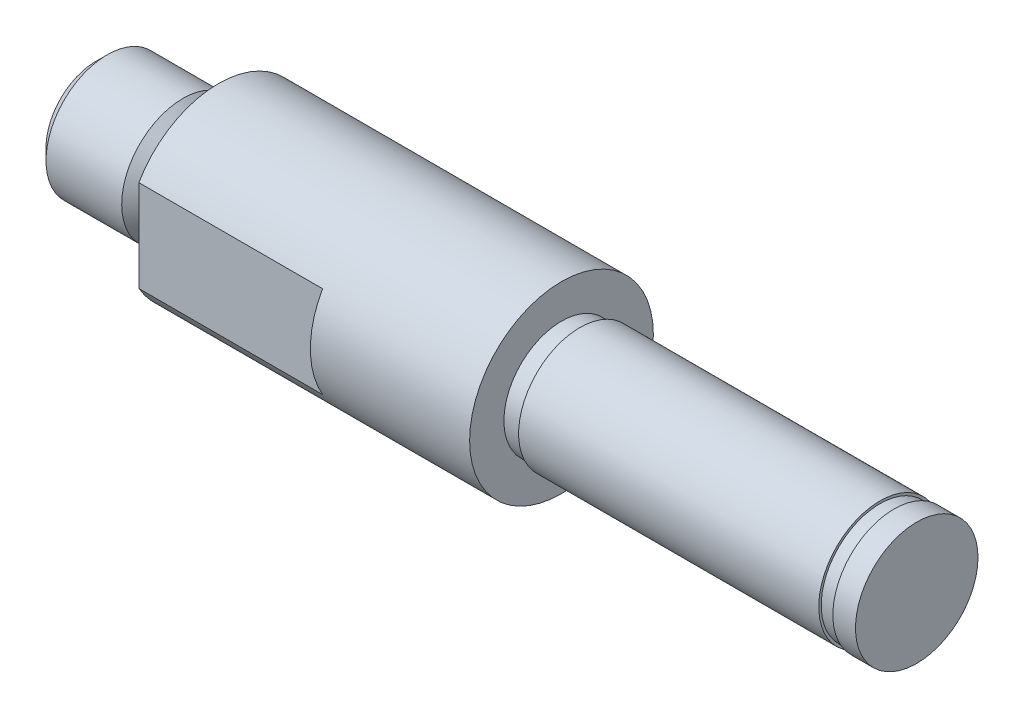
ISO-10303-21;
HEADER;
FILE_DESCRIPTION(('STEP AP214'),'2;1');
FILE_NAME('part.step','',(''),(''),'','','');
FILE_SCHEMA(('AUTOMOTIVE_DESIGN { 1 0 10303 214 1 1 1 1 }'));
ENDSEC;
DATA;
#1=APPLICATION_CONTEXT('core data for automotive mechanical design processes');
#2=APPLICATION_PROTOCOL_DEFINITION('international standard','automotive_design',2000,#1);
#3=PRODUCT_CONTEXT('',#1,'mechanical');
#4=PRODUCT('Part','Part','',(#3));
#5=PRODUCT_RELATED_PRODUCT_CATEGORY('part','',(#4));
#6=PRODUCT_DEFINITION_FORMATION('','',#4);
#7=PRODUCT_DEFINITION_CONTEXT('part definition',#1,'design');
#8=PRODUCT_DEFINITION('design','',#6,#7);
#9=PRODUCT_DEFINITION_SHAPE('','',#8);
#10=(LENGTH_UNIT() NAMED_UNIT(*) SI_UNIT(.MILLI.,.METRE.));
#11=(NAMED_UNIT(*) PLANE_ANGLE_UNIT() SI_UNIT($,.RADIAN.));
#12=(NAMED_UNIT(*) SI_UNIT($,.STERADIAN.) SOLID_ANGLE_UNIT());
#13=UNCERTAINTY_MEASURE_WITH_UNIT(LENGTH_MEASURE(1.E-05),#10,'distance_accuracy_value','');
#14=(GEOMETRIC_REPRESENTATION_CONTEXT(3) GLOBAL_UNCERTAINTY_ASSIGNED_CONTEXT((#13)) GLOBAL_UNIT_ASSIGNED_CONTEXT((#10,
#11,#12)) REPRESENTATION_CONTEXT('',''));
#15=CARTESIAN_POINT('',(0.,0.,0.));
#16=DIRECTION('',(0.,0.,1.));
#17=DIRECTION('',(1.,0.,0.));
#18=AXIS2_PLACEMENT_3D('',#15,#16,#17);
#19=CARTESIAN_POINT('',(67.,2.5,0.));
#20=DIRECTION('',(1.,0.,0.));
#21=DIRECTION('',(0.,0.,-1.));
#22=AXIS2_PLACEMENT_3D('',#19,#20,#21);
#23=PLANE('',#22);
#24=CARTESIAN_POINT('',(67.,0.,0.));
#25=DIRECTION('',(1.,0.,0.));
#26=DIRECTION('',(0.,0.,-1.));
#27=AXIS2_PLACEMENT_3D('',#24,#25,#26);
#28=CIRCLE('',#27,5.);
#29=CARTESIAN_POINT('',(67.,0.,-5.));
#30=VERTEX_POINT('',#29);
#31=EDGE_CURVE('E115',#30,#30,#28,.F.);
#32=ORIENTED_EDGE('',*,*,#31,.F.);
#33=EDGE_LOOP('',(#32));
#34=FACE_BOUND('',#33,.T.);
#35=ADVANCED_FACE('F17',(#34),#23,.T.);
#36=CARTESIAN_POINT('',(0.,2.04,0.));
#37=DIRECTION('',(-1.,0.,0.));
#38=DIRECTION('',(0.,0.,1.));
#39=AXIS2_PLACEMENT_3D('',#36,#37,#38);
#40=PLANE('',#39);
#41=CARTESIAN_POINT('',(0.,0.,0.));
#42=DIRECTION('',(1.,0.,0.));
#43=DIRECTION('',(0.,0.,-1.));
#44=AXIS2_PLACEMENT_3D('',#41,#42,#43);
#45=CIRCLE('',#44,4.08000000010134);
#46=CARTESIAN_POINT('',(0.,0.,-4.08000000010134));
#47=VERTEX_POINT('',#46);
#48=EDGE_CURVE('E112',#47,#47,#45,.T.);
#49=ORIENTED_EDGE('',*,*,#48,.F.);
#50=EDGE_LOOP('',(#49));
#51=FACE_BOUND('',#50,.T.);
#52=ADVANCED_FACE('F197',(#51),#40,.T.);
#53=CARTESIAN_POINT('',(66.075,0.,0.));
#54=DIRECTION('',(1.,0.,0.));
#55=DIRECTION('',(0.,0.,-1.));
#56=AXIS2_PLACEMENT_3D('',#53,#54,#55);
#57=CYLINDRICAL_SURFACE('',#56,5.);
#58=CARTESIAN_POINT('',(65.15,0.,0.));
#59=DIRECTION('',(1.,0.,0.));
#60=DIRECTION('',(0.,0.,-1.));
#61=AXIS2_PLACEMENT_3D('',#58,#59,#60);
#62=CIRCLE('',#61,5.);
#63=CARTESIAN_POINT('',(65.15,0.,-5.));
#64=VERTEX_POINT('',#63);
#65=EDGE_CURVE('E109',#64,#64,#62,.F.);
#66=ORIENTED_EDGE('',*,*,#65,.F.);
#67=EDGE_LOOP('',(#66));
#68=FACE_BOUND('',#67,.T.);
#69=ORIENTED_EDGE('',*,*,#31,.T.);
#70=EDGE_LOOP('',(#69));
#71=FACE_BOUND('',#70,.T.);
#72=ADVANCED_FACE('F194',(#68,#71),#57,.T.);
#73=CARTESIAN_POINT('',(0.91999999995096,0.,0.));
#74=DIRECTION('',(1.,0.,0.));
#75=DIRECTION('',(0.,0.,-1.));
#76=AXIS2_PLACEMENT_3D('',#73,#74,#75);
#77=CONICAL_SURFACE('',#76,5.0000000000523,0.785398163397448);
#78=ORIENTED_EDGE('',*,*,#48,.T.);
#79=EDGE_LOOP('',(#78));
#80=FACE_BOUND('',#79,.T.);
#81=CARTESIAN_POINT('',(0.92,0.,0.));
#82=DIRECTION('',(1.,0.,0.));
#83=DIRECTION('',(0.,0.,-1.));
#84=AXIS2_PLACEMENT_3D('',#81,#82,#83);
#85=CIRCLE('',#84,5.);
#86=CARTESIAN_POINT('',(0.92,0.,-5.));
#87=VERTEX_POINT('',#86);
#88=EDGE_CURVE('E108',#87,#87,#85,.T.);
#89=ORIENTED_EDGE('',*,*,#88,.F.);
#90=EDGE_LOOP('',(#89));
#91=FACE_BOUND('',#90,.T.);
#92=ADVANCED_FACE('F190',(#80,#91),#77,.T.);
#93=CARTESIAN_POINT('',(65.15,4.9,0.));
#94=DIRECTION('',(-1.,0.,0.));
#95=DIRECTION('',(0.,0.,1.));
#96=AXIS2_PLACEMENT_3D('',#93,#94,#95);
#97=PLANE('',#96);
#98=ORIENTED_EDGE('',*,*,#65,.T.);
#99=EDGE_LOOP('',(#98));
#100=FACE_BOUND('',#99,.T.);
#101=CARTESIAN_POINT('',(65.15,0.,0.));
#102=DIRECTION('',(1.,0.,0.));
#103=DIRECTION('',(0.,0.,-1.));
#104=AXIS2_PLACEMENT_3D('',#101,#102,#103);
#105=CIRCLE('',#104,4.8);
#106=CARTESIAN_POINT('',(65.15,0.,-4.8));
#107=VERTEX_POINT('',#106);
#108=EDGE_CURVE('E105',#107,#107,#105,.F.);
#109=ORIENTED_EDGE('',*,*,#108,.F.);
#110=EDGE_LOOP('',(#109));
#111=FACE_BOUND('',#110,.T.);
#112=ADVANCED_FACE('F186',(#100,#111),#97,.T.);
#113=CARTESIAN_POINT('',(4.01,0.,0.));
#114=DIRECTION('',(1.,0.,0.));
#115=DIRECTION('',(0.,0.,-1.));
#116=AXIS2_PLACEMENT_3D('',#113,#114,#115);
#117=CYLINDRICAL_SURFACE('',#116,5.);
#118=ORIENTED_EDGE('',*,*,#88,.T.);
#119=EDGE_LOOP('',(#118));
#120=FACE_BOUND('',#119,.T.);
#121=CARTESIAN_POINT('',(7.10000000003674,0.,0.));
#122=DIRECTION('',(-1.,0.,0.));
#123=DIRECTION('',(0.,1.,0.));
#124=AXIS2_PLACEMENT_3D('',#121,#122,#123);
#125=CIRCLE('',#124,4.99999999999545);
#126=CARTESIAN_POINT('',(7.10000000003674,4.99999999999545,0.));
#127=VERTEX_POINT('',#126);
#128=EDGE_CURVE('E104',#127,#127,#125,.F.);
#129=ORIENTED_EDGE('',*,*,#128,.F.);
#130=EDGE_LOOP('',(#129));
#131=FACE_BOUND('',#130,.T.);
#132=ADVANCED_FACE('F182',(#120,#131),#117,.T.);
#133=CARTESIAN_POINT('',(64.575,0.,0.));
#134=DIRECTION('',(1.,0.,0.));
#135=DIRECTION('',(0.,0.,-1.));
#136=AXIS2_PLACEMENT_3D('',#133,#134,#135);
#137=CYLINDRICAL_SURFACE('',#136,4.8);
#138=CARTESIAN_POINT('',(64.,0.,0.));
#139=DIRECTION('',(1.,0.,0.));
#140=DIRECTION('',(0.,0.,-1.));
#141=AXIS2_PLACEMENT_3D('',#138,#139,#140);
#142=CIRCLE('',#141,4.8);
#143=CARTESIAN_POINT('',(64.,0.,-4.8));
#144=VERTEX_POINT('',#143);
#145=EDGE_CURVE('E101',#144,#144,#142,.F.);
#146=ORIENTED_EDGE('',*,*,#145,.F.);
#147=EDGE_LOOP('',(#146));
#148=FACE_BOUND('',#147,.T.);
#149=ORIENTED_EDGE('',*,*,#108,.T.);
#150=EDGE_LOOP('',(#149));
#151=FACE_BOUND('',#150,.T.);
#152=ADVANCED_FACE('F178',(#148,#151),#137,.T.);
#153=CARTESIAN_POINT('',(7.10000000009359,0.,0.));
#154=DIRECTION('',(-1.,0.,0.));
#155=DIRECTION('',(0.,0.,1.));
#156=AXIS2_PLACEMENT_3D('',#153,#154,#155);
#157=CONICAL_SURFACE('',#156,4.99999999993861,0.785398163397448);
#158=ORIENTED_EDGE('',*,*,#128,.T.);
#159=EDGE_LOOP('',(#158));
#160=FACE_BOUND('',#159,.T.);
#161=CARTESIAN_POINT('',(7.88284271247462,0.,0.));
#162=DIRECTION('',(-1.,0.,0.));
#163=DIRECTION('',(0.,0.,1.));
#164=AXIS2_PLACEMENT_3D('',#161,#162,#163);
#165=CIRCLE('',#164,4.21715728752538);
#166=CARTESIAN_POINT('',(7.88284271247462,0.,4.21715728752538));
#167=VERTEX_POINT('',#166);
#168=EDGE_CURVE('E100',#167,#167,#165,.T.);
#169=ORIENTED_EDGE('',*,*,#168,.T.);
#170=EDGE_LOOP('',(#169));
#171=FACE_BOUND('',#170,.T.);
#172=ADVANCED_FACE('F174',(#160,#171),#157,.T.);
#173=CARTESIAN_POINT('',(64.,4.9,0.));
#174=DIRECTION('',(1.,0.,0.));
#175=DIRECTION('',(0.,0.,-1.));
#176=AXIS2_PLACEMENT_3D('',#173,#174,#175);
#177=PLANE('',#176);
#178=ORIENTED_EDGE('',*,*,#145,.T.);
#179=EDGE_LOOP('',(#178));
#180=FACE_BOUND('',#179,.T.);
#181=CARTESIAN_POINT('',(64.,0.,0.));
#182=DIRECTION('',(1.,0.,0.));
#183=DIRECTION('',(0.,0.,-1.));
#184=AXIS2_PLACEMENT_3D('',#181,#182,#183);
#185=CIRCLE('',#184,5.);
#186=CARTESIAN_POINT('',(64.,0.,-5.));
#187=VERTEX_POINT('',#186);
#188=EDGE_CURVE('E97',#187,#187,#185,.F.);
#189=ORIENTED_EDGE('',*,*,#188,.F.);
#190=EDGE_LOOP('',(#189));
#191=FACE_BOUND('',#190,.T.);
#192=ADVANCED_FACE('F170',(#180,#191),#177,.T.);
#193=CARTESIAN_POINT('',(8.16568542494924,0.,0.));
#194=DIRECTION('',(-1.,0.,0.));
#195=DIRECTION('',(0.,0.,1.));
#196=AXIS2_PLACEMENT_3D('',#193,#194,#195);
#197=TOROIDAL_SURFACE('',#196,4.5,0.400000000000005);
#198=CARTESIAN_POINT('',(8.16568542494924,0.,0.));
#199=DIRECTION('',(1.,0.,0.));
#200=DIRECTION('',(0.,0.,-1.));
#201=AXIS2_PLACEMENT_3D('',#198,#199,#200);
#202=CIRCLE('',#201,4.1);
#203=CARTESIAN_POINT('',(8.16568542494924,0.,-4.1));
#204=VERTEX_POINT('',#203);
#205=EDGE_CURVE('E96',#204,#204,#202,.T.);
#206=ORIENTED_EDGE('',*,*,#205,.F.);
#207=EDGE_LOOP('',(#206));
#208=FACE_BOUND('',#207,.T.);
#209=ORIENTED_EDGE('',*,*,#168,.F.);
#210=EDGE_LOOP('',(#209));
#211=FACE_BOUND('',#210,.T.);
#212=ADVANCED_FACE('F165',(#208,#211),#197,.F.);
#213=CARTESIAN_POINT('',(51.1,0.,0.));
#214=DIRECTION('',(1.,0.,0.));
#215=DIRECTION('',(0.,0.,-1.));
#216=AXIS2_PLACEMENT_3D('',#213,#214,#215);
#217=CYLINDRICAL_SURFACE('',#216,5.);
#218=ORIENTED_EDGE('',*,*,#188,.T.);
#219=EDGE_LOOP('',(#218));
#220=FACE_BOUND('',#219,.T.);
#221=CARTESIAN_POINT('',(39.5,0.,0.));
#222=DIRECTION('',(1.,0.,0.));
#223=DIRECTION('',(0.,0.,-1.));
#224=AXIS2_PLACEMENT_3D('',#221,#222,#223);
#225=CIRCLE('',#224,5.);
#226=CARTESIAN_POINT('',(39.5,0.,-5.));
#227=VERTEX_POINT('',#226);
#228=EDGE_CURVE('E93',#227,#227,#225,.T.);
#229=ORIENTED_EDGE('',*,*,#228,.T.);
#230=EDGE_LOOP('',(#229));
#231=FACE_BOUND('',#230,.T.);
#232=ADVANCED_FACE('F169',(#220,#231),#217,.T.);
#233=CARTESIAN_POINT('',(8.88284271247462,0.,0.));
#234=DIRECTION('',(1.,0.,0.));
#235=DIRECTION('',(0.,0.,-1.));
#236=AXIS2_PLACEMENT_3D('',#233,#234,#235);
#237=CYLINDRICAL_SURFACE('',#236,4.1);
#238=ORIENTED_EDGE('',*,*,#205,.T.);
#239=EDGE_LOOP('',(#238));
#240=FACE_BOUND('',#239,.T.);
#241=CARTESIAN_POINT('',(9.6,0.,0.));
#242=DIRECTION('',(-1.,0.,0.));
#243=DIRECTION('',(0.,0.,1.));
#244=AXIS2_PLACEMENT_3D('',#241,#242,#243);
#245=CIRCLE('',#244,4.1);
#246=CARTESIAN_POINT('',(9.6,0.,4.1));
#247=VERTEX_POINT('',#246);
#248=EDGE_CURVE('E68',#247,#247,#245,.T.);
#249=ORIENTED_EDGE('',*,*,#248,.T.);
#250=EDGE_LOOP('',(#249));
#251=FACE_BOUND('',#250,.T.);
#252=ADVANCED_FACE('F306',(#240,#251),#237,.T.);
#253=CARTESIAN_POINT('',(39.5,7.2,0.));
#254=DIRECTION('',(1.,0.,0.));
#255=DIRECTION('',(0.,0.,-1.));
#256=AXIS2_PLACEMENT_3D('',#253,#254,#255);
#257=PLANE('',#256);
#258=CARTESIAN_POINT('',(39.5,0.,0.));
#259=DIRECTION('',(1.,0.,0.));
#260=DIRECTION('',(0.,0.,-1.));
#261=AXIS2_PLACEMENT_3D('',#258,#259,#260);
#262=CIRCLE('',#261,4.7);
#263=CARTESIAN_POINT('',(39.5,0.,-4.7));
#264=VERTEX_POINT('',#263);
#265=EDGE_CURVE('E67',#264,#264,#262,.F.);
#266=ORIENTED_EDGE('',*,*,#265,.F.);
#267=EDGE_LOOP('',(#266));
#268=FACE_BOUND('',#267,.T.);
#269=ORIENTED_EDGE('',*,*,#228,.F.);
#270=EDGE_LOOP('',(#269));
#271=FACE_BOUND('',#270,.T.);
#272=ADVANCED_FACE('F140',(#268,#271),#257,.F.);
#273=CARTESIAN_POINT('',(9.6,0.,0.));
#274=DIRECTION('',(-1.,0.,0.));
#275=DIRECTION('',(0.,0.,1.));
#276=AXIS2_PLACEMENT_3D('',#273,#274,#275);
#277=TOROIDAL_SURFACE('',#276,4.5,0.400000000000001);
#278=CARTESIAN_POINT('',(10.,0.,0.));
#279=DIRECTION('',(-1.,0.,0.));
#280=DIRECTION('',(0.,0.,-1.));
#281=AXIS2_PLACEMENT_3D('',#278,#279,#280);
#282=CIRCLE('',#281,4.5);
#283=CARTESIAN_POINT('',(10.,0.,4.5));
#284=VERTEX_POINT('',#283);
#285=CARTESIAN_POINT('',(10.,0.,-4.5));
#286=VERTEX_POINT('',#285);
#287=EDGE_CURVE('E85',#284,#286,#282,.F.);
#288=ORIENTED_EDGE('',*,*,#287,.F.);
#289=CARTESIAN_POINT('',(10.,0.,0.));
#290=DIRECTION('',(-1.,0.,0.));
#291=DIRECTION('',(0.,0.,1.));
#292=AXIS2_PLACEMENT_3D('',#289,#290,#291);
#293=CIRCLE('',#292,4.5);
#294=CARTESIAN_POINT('',(10.,4.5,0.));
#295=VERTEX_POINT('',#294);
#296=EDGE_CURVE('E125',#295,#284,#293,.F.);
#297=ORIENTED_EDGE('',*,*,#296,.F.);
#298=CARTESIAN_POINT('',(10.,0.,0.));
#299=DIRECTION('',(-1.,0.,0.));
#300=DIRECTION('',(0.,1.,0.));
#301=AXIS2_PLACEMENT_3D('',#298,#299,#300);
#302=CIRCLE('',#301,4.5);
#303=EDGE_CURVE('E250',#286,#295,#302,.F.);
#304=ORIENTED_EDGE('',*,*,#303,.F.);
#305=EDGE_LOOP('',(#288,#297,#304));
#306=FACE_BOUND('',#305,.T.);
#307=ORIENTED_EDGE('',*,*,#248,.F.);
#308=EDGE_LOOP('',(#307));
#309=FACE_BOUND('',#308,.T.);
#310=ADVANCED_FACE('F129',(#306,#309),#277,.F.);
#311=CARTESIAN_POINT('',(25.,15.,-6.5));
#312=DIRECTION('',(1.,0.,0.));
#313=DIRECTION('',(0.,0.,-1.));
#314=AXIS2_PLACEMENT_3D('',#311,#312,#313);
#315=PLANE('',#314);
#316=DIRECTION('',(0.,1.,0.));
#317=VECTOR('',#316,1.);
#318=CARTESIAN_POINT('',(25.,15.,-6.5));
#319=LINE('',#318,#317);
#320=CARTESIAN_POINT('',(25.,-3.74165738677394,-6.5));
#321=VERTEX_POINT('',#320);
#322=CARTESIAN_POINT('',(25.,3.74165738677394,-6.5));
#323=VERTEX_POINT('',#322);
#324=EDGE_CURVE('E59',#321,#323,#319,.T.);
#325=ORIENTED_EDGE('',*,*,#324,.T.);
#326=CARTESIAN_POINT('',(25.,0.,0.));
#327=DIRECTION('',(1.,0.,0.));
#328=DIRECTION('',(0.,0.,-1.));
#329=AXIS2_PLACEMENT_3D('',#326,#327,#328);
#330=CIRCLE('',#329,7.5);
#331=EDGE_CURVE('E63',#321,#323,#330,.T.);
#332=ORIENTED_EDGE('',*,*,#331,.F.);
#333=EDGE_LOOP('',(#325,#332));
#334=FACE_BOUND('',#333,.T.);
#335=ADVANCED_FACE('F61',(#334),#315,.F.);
#336=CARTESIAN_POINT('',(10.,15.,-6.5));
#337=DIRECTION('',(0.,0.,1.));
#338=DIRECTION('',(1.,0.,0.));
#339=AXIS2_PLACEMENT_3D('',#336,#337,#338);
#340=PLANE('',#339);
#341=DIRECTION('',(0.,1.,0.));
#342=VECTOR('',#341,1.);
#343=CARTESIAN_POINT('',(10.,6.,-6.5));
#344=LINE('',#343,#342);
#345=CARTESIAN_POINT('',(10.,3.74165738677394,-6.5));
#346=VERTEX_POINT('',#345);
#347=CARTESIAN_POINT('',(10.,-3.74165738677394,-6.5));
#348=VERTEX_POINT('',#347);
#349=EDGE_CURVE('E75',#346,#348,#344,.F.);
#350=ORIENTED_EDGE('',*,*,#349,.F.);
#351=DIRECTION('',(1.,0.,0.));
#352=VECTOR('',#351,1.);
#353=CARTESIAN_POINT('',(24.,3.74165738677394,-6.5));
#354=LINE('',#353,#352);
#355=EDGE_CURVE('E72',#323,#346,#354,.F.);
#356=ORIENTED_EDGE('',*,*,#355,.F.);
#357=ORIENTED_EDGE('',*,*,#324,.F.);
#358=DIRECTION('',(1.,0.,0.));
#359=VECTOR('',#358,1.);
#360=CARTESIAN_POINT('',(24.,-3.74165738677394,-6.5));
#361=LINE('',#360,#359);
#362=EDGE_CURVE('E83',#348,#321,#361,.T.);
#363=ORIENTED_EDGE('',*,*,#362,.F.);
#364=EDGE_LOOP('',(#350,#356,#357,#363));
#365=FACE_BOUND('',#364,.T.);
#366=ADVANCED_FACE('F73',(#365),#340,.F.);
#367=CARTESIAN_POINT('',(38.75,0.,0.));
#368=DIRECTION('',(1.,0.,0.));
#369=DIRECTION('',(0.,0.,-1.));
#370=AXIS2_PLACEMENT_3D('',#367,#368,#369);
#371=CYLINDRICAL_SURFACE('',#370,4.7);
#372=CARTESIAN_POINT('',(38.,0.,0.));
#373=DIRECTION('',(1.,0.,0.));
#374=DIRECTION('',(0.,0.,-1.));
#375=AXIS2_PLACEMENT_3D('',#372,#373,#374);
#376=CIRCLE('',#375,4.7);
#377=CARTESIAN_POINT('',(38.,0.,-4.7));
#378=VERTEX_POINT('',#377);
#379=EDGE_CURVE('E78',#378,#378,#376,.F.);
#380=ORIENTED_EDGE('',*,*,#379,.F.);
#381=EDGE_LOOP('',(#380));
#382=FACE_BOUND('',#381,.T.);
#383=ORIENTED_EDGE('',*,*,#265,.T.);
#384=EDGE_LOOP('',(#383));
#385=FACE_BOUND('',#384,.T.);
#386=ADVANCED_FACE('F281',(#382,#385),#371,.T.);
#387=CARTESIAN_POINT('',(25.,15.,14.));
#388=DIRECTION('',(1.,0.,0.));
#389=DIRECTION('',(0.,0.,-1.));
#390=AXIS2_PLACEMENT_3D('',#387,#388,#389);
#391=PLANE('',#390);
#392=DIRECTION('',(0.,1.,0.));
#393=VECTOR('',#392,1.);
#394=CARTESIAN_POINT('',(25.,15.,6.5));
#395=LINE('',#394,#393);
#396=CARTESIAN_POINT('',(25.,3.74165738677394,6.5));
#397=VERTEX_POINT('',#396);
#398=CARTESIAN_POINT('',(25.,-3.74165738677394,6.5));
#399=VERTEX_POINT('',#398);
#400=EDGE_CURVE('E92',#397,#399,#395,.F.);
#401=ORIENTED_EDGE('',*,*,#400,.T.);
#402=CARTESIAN_POINT('',(25.,0.,0.));
#403=DIRECTION('',(1.,0.,0.));
#404=DIRECTION('',(0.,0.,-1.));
#405=AXIS2_PLACEMENT_3D('',#402,#403,#404);
#406=CIRCLE('',#405,7.5);
#407=EDGE_CURVE('E256',#397,#399,#406,.T.);
#408=ORIENTED_EDGE('',*,*,#407,.F.);
#409=EDGE_LOOP('',(#401,#408));
#410=FACE_BOUND('',#409,.T.);
#411=ADVANCED_FACE('F279',(#410),#391,.F.);
#412=CARTESIAN_POINT('',(25.,15.,6.5));
#413=DIRECTION('',(0.,0.,-1.));
#414=DIRECTION('',(-1.,0.,0.));
#415=AXIS2_PLACEMENT_3D('',#412,#413,#414);
#416=PLANE('',#415);
#417=ORIENTED_EDGE('',*,*,#400,.F.);
#418=DIRECTION('',(1.,0.,0.));
#419=VECTOR('',#418,1.);
#420=CARTESIAN_POINT('',(24.,3.74165738677394,6.5));
#421=LINE('',#420,#419);
#422=CARTESIAN_POINT('',(10.,3.74165738677394,6.5));
#423=VERTEX_POINT('',#422);
#424=EDGE_CURVE('E258',#423,#397,#421,.T.);
#425=ORIENTED_EDGE('',*,*,#424,.F.);
#426=DIRECTION('',(0.,1.,0.));
#427=VECTOR('',#426,1.);
#428=CARTESIAN_POINT('',(10.,6.,6.5));
#429=LINE('',#428,#427);
#430=CARTESIAN_POINT('',(10.,-3.74165738677394,6.5));
#431=VERTEX_POINT('',#430);
#432=EDGE_CURVE('E37',#431,#423,#429,.T.);
#433=ORIENTED_EDGE('',*,*,#432,.F.);
#434=DIRECTION('',(1.,0.,0.));
#435=VECTOR('',#434,1.);
#436=CARTESIAN_POINT('',(24.,-3.74165738677394,6.5));
#437=LINE('',#436,#435);
#438=EDGE_CURVE('E253',#399,#431,#437,.F.);
#439=ORIENTED_EDGE('',*,*,#438,.F.);
#440=EDGE_LOOP('',(#417,#425,#433,#439));
#441=FACE_BOUND('',#440,.T.);
#442=ADVANCED_FACE('F220',(#441),#416,.F.);
#443=CARTESIAN_POINT('',(10.,6.,0.));
#444=DIRECTION('',(-1.,0.,0.));
#445=DIRECTION('',(0.,0.,1.));
#446=AXIS2_PLACEMENT_3D('',#443,#444,#445);
#447=PLANE('',#446);
#448=ORIENTED_EDGE('',*,*,#296,.T.);
#449=ORIENTED_EDGE('',*,*,#287,.T.);
#450=ORIENTED_EDGE('',*,*,#303,.T.);
#451=EDGE_LOOP('',(#448,#449,#450));
#452=FACE_BOUND('',#451,.T.);
#453=CARTESIAN_POINT('',(10.,0.,0.));
#454=DIRECTION('',(1.,0.,0.));
#455=DIRECTION('',(0.,0.,-1.));
#456=AXIS2_PLACEMENT_3D('',#453,#454,#455);
#457=CIRCLE('',#456,7.5);
#458=EDGE_CURVE('E260',#346,#423,#457,.T.);
#459=ORIENTED_EDGE('',*,*,#458,.F.);
#460=ORIENTED_EDGE('',*,*,#349,.T.);
#461=CARTESIAN_POINT('',(10.,0.,0.));
#462=DIRECTION('',(1.,0.,0.));
#463=DIRECTION('',(0.,0.,-1.));
#464=AXIS2_PLACEMENT_3D('',#461,#462,#463);
#465=CIRCLE('',#464,7.5);
#466=EDGE_CURVE('E28',#431,#348,#465,.T.);
#467=ORIENTED_EDGE('',*,*,#466,.F.);
#468=ORIENTED_EDGE('',*,*,#432,.T.);
#469=EDGE_LOOP('',(#459,#460,#467,#468));
#470=FACE_BOUND('',#469,.T.);
#471=ADVANCED_FACE('F213',(#452,#470),#447,.T.);
#472=CARTESIAN_POINT('',(38.,6.35,0.));
#473=DIRECTION('',(1.,0.,0.));
#474=DIRECTION('',(0.,0.,-1.));
#475=AXIS2_PLACEMENT_3D('',#472,#473,#474);
#476=PLANE('',#475);
#477=CARTESIAN_POINT('',(38.,0.,0.));
#478=DIRECTION('',(1.,0.,0.));
#479=DIRECTION('',(0.,0.,-1.));
#480=AXIS2_PLACEMENT_3D('',#477,#478,#479);
#481=CIRCLE('',#480,7.5);
#482=CARTESIAN_POINT('',(38.,0.,-7.5));
#483=VERTEX_POINT('',#482);
#484=EDGE_CURVE('E11',#483,#483,#481,.F.);
#485=ORIENTED_EDGE('',*,*,#484,.F.);
#486=EDGE_LOOP('',(#485));
#487=FACE_BOUND('',#486,.T.);
#488=ORIENTED_EDGE('',*,*,#379,.T.);
#489=EDGE_LOOP('',(#488));
#490=FACE_BOUND('',#489,.T.);
#491=ADVANCED_FACE('F208',(#487,#490),#476,.T.);
#492=CARTESIAN_POINT('',(24.,0.,0.));
#493=DIRECTION('',(1.,0.,0.));
#494=DIRECTION('',(0.,0.,-1.));
#495=AXIS2_PLACEMENT_3D('',#492,#493,#494);
#496=CYLINDRICAL_SURFACE('',#495,7.5);
#497=ORIENTED_EDGE('',*,*,#355,.T.);
#498=ORIENTED_EDGE('',*,*,#458,.T.);
#499=ORIENTED_EDGE('',*,*,#424,.T.);
#500=ORIENTED_EDGE('',*,*,#407,.T.);
#501=ORIENTED_EDGE('',*,*,#438,.T.);
#502=ORIENTED_EDGE('',*,*,#466,.T.);
#503=ORIENTED_EDGE('',*,*,#362,.T.);
#504=ORIENTED_EDGE('',*,*,#331,.T.);
#505=EDGE_LOOP('',(#497,#498,#499,#500,#501,#502,#503,#504));
#506=FACE_BOUND('',#505,.T.);
#507=ORIENTED_EDGE('',*,*,#484,.T.);
#508=EDGE_LOOP('',(#507));
#509=FACE_BOUND('',#508,.T.);
#510=ADVANCED_FACE('F80',(#506,#509),#496,.T.);
#511=CLOSED_SHELL('',(#35,#52,#72,#92,#112,#132,#152,#172,#192,#212,#232,#252,#272,#310,#335,
#366,#386,#411,#442,#471,#491,#510));
#512=MANIFOLD_SOLID_BREP('B1',#511);
#513=ADVANCED_BREP_SHAPE_REPRESENTATION('',(#18,#512),#14);
#514=SHAPE_DEFINITION_REPRESENTATION(#9,#513);
ENDSEC;
END-ISO-10303-21;
